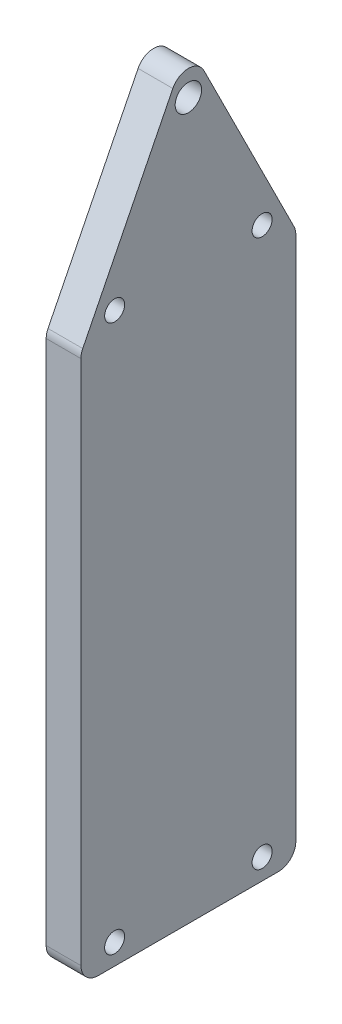
ISO-10303-21;
HEADER;
FILE_DESCRIPTION(('STEP AP214'),'2;1');
FILE_NAME('part.step','',(''),(''),'','','');
FILE_SCHEMA(('AUTOMOTIVE_DESIGN { 1 0 10303 214 1 1 1 1 }'));
ENDSEC;
DATA;
#1=APPLICATION_CONTEXT('core data for automotive mechanical design processes');
#2=APPLICATION_PROTOCOL_DEFINITION('international standard','automotive_design',2000,#1);
#3=PRODUCT_CONTEXT('',#1,'mechanical');
#4=PRODUCT('Part','Part','',(#3));
#5=PRODUCT_RELATED_PRODUCT_CATEGORY('part','',(#4));
#6=PRODUCT_DEFINITION_FORMATION('','',#4);
#7=PRODUCT_DEFINITION_CONTEXT('part definition',#1,'design');
#8=PRODUCT_DEFINITION('design','',#6,#7);
#9=PRODUCT_DEFINITION_SHAPE('','',#8);
#10=(LENGTH_UNIT() NAMED_UNIT(*) SI_UNIT(.MILLI.,.METRE.));
#11=(NAMED_UNIT(*) PLANE_ANGLE_UNIT() SI_UNIT($,.RADIAN.));
#12=(NAMED_UNIT(*) SI_UNIT($,.STERADIAN.) SOLID_ANGLE_UNIT());
#13=UNCERTAINTY_MEASURE_WITH_UNIT(LENGTH_MEASURE(1.E-05),#10,'distance_accuracy_value','');
#14=(GEOMETRIC_REPRESENTATION_CONTEXT(3) GLOBAL_UNCERTAINTY_ASSIGNED_CONTEXT((#13)) GLOBAL_UNIT_ASSIGNED_CONTEXT((#10,
#11,#12)) REPRESENTATION_CONTEXT('',''));
#15=CARTESIAN_POINT('',(0.,0.,0.));
#16=DIRECTION('',(0.,0.,1.));
#17=DIRECTION('',(1.,0.,0.));
#18=AXIS2_PLACEMENT_3D('',#15,#16,#17);
#19=CARTESIAN_POINT('',(6.35,0.,19.6394094971371));
#20=DIRECTION('',(0.,0.,-1.));
#21=DIRECTION('',(0.,1.,0.));
#22=AXIS2_PLACEMENT_3D('',#19,#20,#21);
#23=PLANE('',#22);
#24=DIRECTION('',(0.,-1.,0.));
#25=VECTOR('',#24,1.);
#26=CARTESIAN_POINT('',(0.,0.,19.6394094971371));
#27=LINE('',#26,#25);
#28=CARTESIAN_POINT('',(0.,-4.55951582856184,19.6394094971371));
#29=VERTEX_POINT('',#28);
#30=CARTESIAN_POINT('',(0.,-100.635,19.6394094971371));
#31=VERTEX_POINT('',#30);
#32=EDGE_CURVE('E140',#29,#31,#27,.T.);
#33=ORIENTED_EDGE('',*,*,#32,.T.);
#34=DIRECTION('',(-1.,0.,0.));
#35=VECTOR('',#34,1.);
#36=CARTESIAN_POINT('',(6.35,-100.635,19.6394094971371));
#37=LINE('',#36,#35);
#38=CARTESIAN_POINT('',(6.35,-100.635,19.6394094971371));
#39=VERTEX_POINT('',#38);
#40=EDGE_CURVE('E117',#31,#39,#37,.F.);
#41=ORIENTED_EDGE('',*,*,#40,.T.);
#42=DIRECTION('',(0.,-1.,0.));
#43=VECTOR('',#42,1.);
#44=CARTESIAN_POINT('',(6.35,0.,19.6394094971371));
#45=LINE('',#44,#43);
#46=CARTESIAN_POINT('',(6.35,-4.55951582856184,19.6394094971371));
#47=VERTEX_POINT('',#46);
#48=EDGE_CURVE('E282',#47,#39,#45,.T.);
#49=ORIENTED_EDGE('',*,*,#48,.F.);
#50=DIRECTION('',(-1.,0.,0.));
#51=VECTOR('',#50,1.);
#52=CARTESIAN_POINT('',(0.,-4.55951582856184,19.6394094971371));
#53=LINE('',#52,#51);
#54=EDGE_CURVE('E122',#47,#29,#53,.T.);
#55=ORIENTED_EDGE('',*,*,#54,.T.);
#56=EDGE_LOOP('',(#33,#41,#49,#55));
#57=FACE_BOUND('',#56,.T.);
#58=ADVANCED_FACE('F34',(#57),#23,.F.);
#59=CARTESIAN_POINT('',(6.35,-103.81,0.));
#60=DIRECTION('',(0.,1.,0.));
#61=DIRECTION('',(0.,0.,1.));
#62=AXIS2_PLACEMENT_3D('',#59,#60,#61);
#63=PLANE('',#62);
#64=DIRECTION('',(0.,0.,-1.));
#65=VECTOR('',#64,1.);
#66=CARTESIAN_POINT('',(6.35,-103.81,0.));
#67=LINE('',#66,#65);
#68=CARTESIAN_POINT('',(6.35,-103.81,16.4644094971371));
#69=VERTEX_POINT('',#68);
#70=CARTESIAN_POINT('',(6.35,-103.81,-16.4644094971371));
#71=VERTEX_POINT('',#70);
#72=EDGE_CURVE('E132',#69,#71,#67,.T.);
#73=ORIENTED_EDGE('',*,*,#72,.F.);
#74=DIRECTION('',(-1.,0.,0.));
#75=VECTOR('',#74,1.);
#76=CARTESIAN_POINT('',(6.35,-103.81,16.4644094971371));
#77=LINE('',#76,#75);
#78=CARTESIAN_POINT('',(0.,-103.81,16.4644094971371));
#79=VERTEX_POINT('',#78);
#80=EDGE_CURVE('E116',#69,#79,#77,.T.);
#81=ORIENTED_EDGE('',*,*,#80,.T.);
#82=DIRECTION('',(0.,0.,-1.));
#83=VECTOR('',#82,1.);
#84=CARTESIAN_POINT('',(0.,-103.81,0.));
#85=LINE('',#84,#83);
#86=CARTESIAN_POINT('',(0.,-103.81,-16.4644094971371));
#87=VERTEX_POINT('',#86);
#88=EDGE_CURVE('E129',#79,#87,#85,.T.);
#89=ORIENTED_EDGE('',*,*,#88,.T.);
#90=DIRECTION('',(-1.,0.,0.));
#91=VECTOR('',#90,1.);
#92=CARTESIAN_POINT('',(6.35,-103.81,-16.4644094971371));
#93=LINE('',#92,#91);
#94=EDGE_CURVE('E134',#87,#71,#93,.F.);
#95=ORIENTED_EDGE('',*,*,#94,.T.);
#96=EDGE_LOOP('',(#73,#81,#89,#95));
#97=FACE_BOUND('',#96,.T.);
#98=ADVANCED_FACE('F128',(#97),#63,.F.);
#99=CARTESIAN_POINT('',(6.35,0.,-19.6394094971371));
#100=DIRECTION('',(0.,0.,-1.));
#101=DIRECTION('',(0.,1.,0.));
#102=AXIS2_PLACEMENT_3D('',#99,#100,#101);
#103=PLANE('',#102);
#104=DIRECTION('',(0.,-1.,0.));
#105=VECTOR('',#104,1.);
#106=CARTESIAN_POINT('',(6.35,0.,-19.6394094971371));
#107=LINE('',#106,#105);
#108=CARTESIAN_POINT('',(6.35,-4.55951582856183,-19.6394094971371));
#109=VERTEX_POINT('',#108);
#110=CARTESIAN_POINT('',(6.35,-100.635,-19.6394094971371));
#111=VERTEX_POINT('',#110);
#112=EDGE_CURVE('E213',#109,#111,#107,.T.);
#113=ORIENTED_EDGE('',*,*,#112,.T.);
#114=DIRECTION('',(-1.,0.,0.));
#115=VECTOR('',#114,1.);
#116=CARTESIAN_POINT('',(0.,-100.635,-19.6394094971371));
#117=LINE('',#116,#115);
#118=CARTESIAN_POINT('',(0.,-100.635,-19.6394094971371));
#119=VERTEX_POINT('',#118);
#120=EDGE_CURVE('E185',#111,#119,#117,.T.);
#121=ORIENTED_EDGE('',*,*,#120,.T.);
#122=DIRECTION('',(0.,-1.,0.));
#123=VECTOR('',#122,1.);
#124=CARTESIAN_POINT('',(0.,0.,-19.6394094971371));
#125=LINE('',#124,#123);
#126=CARTESIAN_POINT('',(0.,-4.55951582856183,-19.6394094971371));
#127=VERTEX_POINT('',#126);
#128=EDGE_CURVE('E139',#127,#119,#125,.T.);
#129=ORIENTED_EDGE('',*,*,#128,.F.);
#130=DIRECTION('',(-1.,0.,0.));
#131=VECTOR('',#130,1.);
#132=CARTESIAN_POINT('',(6.35,-4.55951582856183,-19.6394094971371));
#133=LINE('',#132,#131);
#134=EDGE_CURVE('E183',#127,#109,#133,.F.);
#135=ORIENTED_EDGE('',*,*,#134,.T.);
#136=EDGE_LOOP('',(#113,#121,#129,#135));
#137=FACE_BOUND('',#136,.T.);
#138=ADVANCED_FACE('F248',(#137),#103,.T.);
#139=CARTESIAN_POINT('',(6.35,7.09376379885484,-14.1875275977097));
#140=DIRECTION('',(0.,0.447213595499958,-0.894427190999916));
#141=DIRECTION('',(0.,0.894427190999916,0.447213595499958));
#142=AXIS2_PLACEMENT_3D('',#139,#140,#141);
#143=PLANE('',#142);
#144=DIRECTION('',(0.,-0.894427190999916,-0.447213595499958));
#145=VECTOR('',#144,1.);
#146=CARTESIAN_POINT('',(0.,7.09376379885484,-14.1875275977097));
#147=LINE('',#146,#145);
#148=CARTESIAN_POINT('',(0.,29.7892063314247,-2.83980633142473));
#149=VERTEX_POINT('',#148);
#150=CARTESIAN_POINT('',(0.,-3.13961266284947,-19.3042158285618));
#151=VERTEX_POINT('',#150);
#152=EDGE_CURVE('E142',#149,#151,#147,.T.);
#153=ORIENTED_EDGE('',*,*,#152,.F.);
#154=DIRECTION('',(-1.,0.,0.));
#155=VECTOR('',#154,1.);
#156=CARTESIAN_POINT('',(6.35,29.7892063314247,-2.83980633142473));
#157=LINE('',#156,#155);
#158=CARTESIAN_POINT('',(6.35,29.7892063314247,-2.83980633142473));
#159=VERTEX_POINT('',#158);
#160=EDGE_CURVE('E11',#149,#159,#157,.F.);
#161=ORIENTED_EDGE('',*,*,#160,.T.);
#162=DIRECTION('',(0.,-0.894427190999916,-0.447213595499958));
#163=VECTOR('',#162,1.);
#164=CARTESIAN_POINT('',(6.35,7.09376379885484,-14.1875275977097));
#165=LINE('',#164,#163);
#166=CARTESIAN_POINT('',(6.35,-3.13961266284947,-19.3042158285618));
#167=VERTEX_POINT('',#166);
#168=EDGE_CURVE('E198',#159,#167,#165,.T.);
#169=ORIENTED_EDGE('',*,*,#168,.T.);
#170=DIRECTION('',(-1.,0.,0.));
#171=VECTOR('',#170,1.);
#172=CARTESIAN_POINT('',(6.35,-3.13961266284947,-19.3042158285618));
#173=LINE('',#172,#171);
#174=EDGE_CURVE('E42',#167,#151,#173,.T.);
#175=ORIENTED_EDGE('',*,*,#174,.T.);
#176=EDGE_LOOP('',(#153,#161,#169,#175));
#177=FACE_BOUND('',#176,.T.);
#178=ADVANCED_FACE('F196',(#177),#143,.T.);
#179=CARTESIAN_POINT('',(6.35,26.9494,0.));
#180=DIRECTION('',(-1.,0.,0.));
#181=DIRECTION('',(0.,0.,1.));
#182=AXIS2_PLACEMENT_3D('',#179,#180,#181);
#183=CYLINDRICAL_SURFACE('',#182,2.413);
#184=CARTESIAN_POINT('',(6.35,26.9494,0.));
#185=DIRECTION('',(1.,0.,0.));
#186=DIRECTION('',(0.,0.,-1.));
#187=AXIS2_PLACEMENT_3D('',#184,#185,#186);
#188=CIRCLE('',#187,2.413);
#189=CARTESIAN_POINT('',(6.35,26.9494,-2.413));
#190=VERTEX_POINT('',#189);
#191=EDGE_CURVE('E211',#190,#190,#188,.T.);
#192=ORIENTED_EDGE('',*,*,#191,.T.);
#193=EDGE_LOOP('',(#192));
#194=FACE_BOUND('',#193,.T.);
#195=CARTESIAN_POINT('',(0.,26.9494,0.));
#196=DIRECTION('',(1.,0.,0.));
#197=DIRECTION('',(0.,0.,-1.));
#198=AXIS2_PLACEMENT_3D('',#195,#196,#197);
#199=CIRCLE('',#198,2.413);
#200=CARTESIAN_POINT('',(0.,26.9494,-2.413));
#201=VERTEX_POINT('',#200);
#202=EDGE_CURVE('E156',#201,#201,#199,.T.);
#203=ORIENTED_EDGE('',*,*,#202,.F.);
#204=EDGE_LOOP('',(#203));
#205=FACE_BOUND('',#204,.T.);
#206=ADVANCED_FACE('F255',(#194,#205),#183,.F.);
#207=CARTESIAN_POINT('',(6.35,0.,-13.4747));
#208=DIRECTION('',(-1.,0.,0.));
#209=DIRECTION('',(0.,0.,1.));
#210=AXIS2_PLACEMENT_3D('',#207,#208,#209);
#211=CYLINDRICAL_SURFACE('',#210,1.8288);
#212=CARTESIAN_POINT('',(6.35,0.,-13.4747));
#213=DIRECTION('',(1.,0.,0.));
#214=DIRECTION('',(0.,0.,-1.));
#215=AXIS2_PLACEMENT_3D('',#212,#213,#214);
#216=CIRCLE('',#215,1.8288);
#217=CARTESIAN_POINT('',(6.35,0.,-15.3035));
#218=VERTEX_POINT('',#217);
#219=EDGE_CURVE('E208',#218,#218,#216,.T.);
#220=ORIENTED_EDGE('',*,*,#219,.T.);
#221=EDGE_LOOP('',(#220));
#222=FACE_BOUND('',#221,.T.);
#223=CARTESIAN_POINT('',(0.,0.,-13.4747));
#224=DIRECTION('',(1.,0.,0.));
#225=DIRECTION('',(0.,0.,-1.));
#226=AXIS2_PLACEMENT_3D('',#223,#224,#225);
#227=CIRCLE('',#226,1.8288);
#228=CARTESIAN_POINT('',(0.,0.,-15.3035));
#229=VERTEX_POINT('',#228);
#230=EDGE_CURVE('E153',#229,#229,#227,.T.);
#231=ORIENTED_EDGE('',*,*,#230,.F.);
#232=EDGE_LOOP('',(#231));
#233=FACE_BOUND('',#232,.T.);
#234=ADVANCED_FACE('F239',(#222,#233),#211,.F.);
#235=CARTESIAN_POINT('',(6.35,7.09376379885484,14.1875275977097));
#236=DIRECTION('',(0.,0.447213595499958,0.894427190999916));
#237=DIRECTION('',(0.,-0.894427190999916,0.447213595499958));
#238=AXIS2_PLACEMENT_3D('',#235,#236,#237);
#239=PLANE('',#238);
#240=DIRECTION('',(0.,0.894427190999916,-0.447213595499958));
#241=VECTOR('',#240,1.);
#242=CARTESIAN_POINT('',(6.35,7.09376379885484,14.1875275977097));
#243=LINE('',#242,#241);
#244=CARTESIAN_POINT('',(6.35,-3.13961266284947,19.3042158285618));
#245=VERTEX_POINT('',#244);
#246=CARTESIAN_POINT('',(6.35,29.7892063314247,2.83980633142473));
#247=VERTEX_POINT('',#246);
#248=EDGE_CURVE('E206',#245,#247,#243,.T.);
#249=ORIENTED_EDGE('',*,*,#248,.T.);
#250=DIRECTION('',(-1.,0.,0.));
#251=VECTOR('',#250,1.);
#252=CARTESIAN_POINT('',(6.35,29.7892063314247,2.83980633142473));
#253=LINE('',#252,#251);
#254=CARTESIAN_POINT('',(0.,29.7892063314247,2.83980633142473));
#255=VERTEX_POINT('',#254);
#256=EDGE_CURVE('E189',#247,#255,#253,.T.);
#257=ORIENTED_EDGE('',*,*,#256,.T.);
#258=DIRECTION('',(0.,0.894427190999916,-0.447213595499958));
#259=VECTOR('',#258,1.);
#260=CARTESIAN_POINT('',(0.,7.09376379885484,14.1875275977097));
#261=LINE('',#260,#259);
#262=CARTESIAN_POINT('',(0.,-3.13961266284947,19.3042158285618));
#263=VERTEX_POINT('',#262);
#264=EDGE_CURVE('E150',#263,#255,#261,.T.);
#265=ORIENTED_EDGE('',*,*,#264,.F.);
#266=DIRECTION('',(-1.,0.,0.));
#267=VECTOR('',#266,1.);
#268=CARTESIAN_POINT('',(6.35,-3.13961266284947,19.3042158285618));
#269=LINE('',#268,#267);
#270=EDGE_CURVE('E56',#263,#245,#269,.F.);
#271=ORIENTED_EDGE('',*,*,#270,.T.);
#272=EDGE_LOOP('',(#249,#257,#265,#271));
#273=FACE_BOUND('',#272,.T.);
#274=ADVANCED_FACE('F205',(#273),#239,.T.);
#275=CARTESIAN_POINT('',(6.35,-100.,13.4747));
#276=DIRECTION('',(-1.,0.,0.));
#277=DIRECTION('',(0.,0.,1.));
#278=AXIS2_PLACEMENT_3D('',#275,#276,#277);
#279=CYLINDRICAL_SURFACE('',#278,1.8288);
#280=CARTESIAN_POINT('',(6.35,-100.,13.4747));
#281=DIRECTION('',(1.,0.,0.));
#282=DIRECTION('',(0.,0.,-1.));
#283=AXIS2_PLACEMENT_3D('',#280,#281,#282);
#284=CIRCLE('',#283,1.8288);
#285=CARTESIAN_POINT('',(6.35,-100.,11.6459));
#286=VERTEX_POINT('',#285);
#287=EDGE_CURVE('E278',#286,#286,#284,.T.);
#288=ORIENTED_EDGE('',*,*,#287,.T.);
#289=EDGE_LOOP('',(#288));
#290=FACE_BOUND('',#289,.T.);
#291=CARTESIAN_POINT('',(0.,-100.,13.4747));
#292=DIRECTION('',(1.,0.,0.));
#293=DIRECTION('',(0.,0.,-1.));
#294=AXIS2_PLACEMENT_3D('',#291,#292,#293);
#295=CIRCLE('',#294,1.8288);
#296=CARTESIAN_POINT('',(0.,-100.,11.6459));
#297=VERTEX_POINT('',#296);
#298=EDGE_CURVE('E144',#297,#297,#295,.T.);
#299=ORIENTED_EDGE('',*,*,#298,.F.);
#300=EDGE_LOOP('',(#299));
#301=FACE_BOUND('',#300,.T.);
#302=ADVANCED_FACE('F227',(#290,#301),#279,.F.);
#303=CARTESIAN_POINT('',(6.35,-100.,-13.4747));
#304=DIRECTION('',(-1.,0.,0.));
#305=DIRECTION('',(0.,0.,1.));
#306=AXIS2_PLACEMENT_3D('',#303,#304,#305);
#307=CYLINDRICAL_SURFACE('',#306,1.8288);
#308=CARTESIAN_POINT('',(6.35,-100.,-13.4747));
#309=DIRECTION('',(1.,0.,0.));
#310=DIRECTION('',(0.,0.,-1.));
#311=AXIS2_PLACEMENT_3D('',#308,#309,#310);
#312=CIRCLE('',#311,1.8288);
#313=CARTESIAN_POINT('',(6.35,-100.,-15.3035));
#314=VERTEX_POINT('',#313);
#315=EDGE_CURVE('E162',#314,#314,#312,.T.);
#316=ORIENTED_EDGE('',*,*,#315,.T.);
#317=EDGE_LOOP('',(#316));
#318=FACE_BOUND('',#317,.T.);
#319=CARTESIAN_POINT('',(0.,-100.,-13.4747));
#320=DIRECTION('',(1.,0.,0.));
#321=DIRECTION('',(0.,0.,-1.));
#322=AXIS2_PLACEMENT_3D('',#319,#320,#321);
#323=CIRCLE('',#322,1.8288);
#324=CARTESIAN_POINT('',(0.,-100.,-15.3035));
#325=VERTEX_POINT('',#324);
#326=EDGE_CURVE('E221',#325,#325,#323,.T.);
#327=ORIENTED_EDGE('',*,*,#326,.F.);
#328=EDGE_LOOP('',(#327));
#329=FACE_BOUND('',#328,.T.);
#330=ADVANCED_FACE('F229',(#318,#329),#307,.F.);
#331=CARTESIAN_POINT('',(6.35,0.,13.4747));
#332=DIRECTION('',(-1.,0.,0.));
#333=DIRECTION('',(0.,0.,1.));
#334=AXIS2_PLACEMENT_3D('',#331,#332,#333);
#335=CYLINDRICAL_SURFACE('',#334,1.8288);
#336=CARTESIAN_POINT('',(6.35,0.,13.4747));
#337=DIRECTION('',(1.,0.,0.));
#338=DIRECTION('',(0.,0.,-1.));
#339=AXIS2_PLACEMENT_3D('',#336,#337,#338);
#340=CIRCLE('',#339,1.8288);
#341=CARTESIAN_POINT('',(6.35,0.,11.6459));
#342=VERTEX_POINT('',#341);
#343=EDGE_CURVE('E163',#342,#342,#340,.T.);
#344=ORIENTED_EDGE('',*,*,#343,.T.);
#345=EDGE_LOOP('',(#344));
#346=FACE_BOUND('',#345,.T.);
#347=CARTESIAN_POINT('',(0.,0.,13.4747));
#348=DIRECTION('',(1.,0.,0.));
#349=DIRECTION('',(0.,0.,-1.));
#350=AXIS2_PLACEMENT_3D('',#347,#348,#349);
#351=CIRCLE('',#350,1.8288);
#352=CARTESIAN_POINT('',(0.,0.,11.6459));
#353=VERTEX_POINT('',#352);
#354=EDGE_CURVE('E159',#353,#353,#351,.T.);
#355=ORIENTED_EDGE('',*,*,#354,.F.);
#356=EDGE_LOOP('',(#355));
#357=FACE_BOUND('',#356,.T.);
#358=ADVANCED_FACE('F236',(#346,#357),#335,.F.);
#359=CARTESIAN_POINT('',(6.35,0.,0.));
#360=DIRECTION('',(1.,0.,0.));
#361=DIRECTION('',(0.,0.,-1.));
#362=AXIS2_PLACEMENT_3D('',#359,#360,#361);
#363=PLANE('',#362);
#364=ORIENTED_EDGE('',*,*,#315,.F.);
#365=EDGE_LOOP('',(#364));
#366=FACE_BOUND('',#365,.T.);
#367=ORIENTED_EDGE('',*,*,#287,.F.);
#368=EDGE_LOOP('',(#367));
#369=FACE_BOUND('',#368,.T.);
#370=ORIENTED_EDGE('',*,*,#48,.T.);
#371=CARTESIAN_POINT('',(6.35,-100.635,16.4644094971371));
#372=DIRECTION('',(1.,0.,0.));
#373=DIRECTION('',(0.,0.,-1.));
#374=AXIS2_PLACEMENT_3D('',#371,#372,#373);
#375=CIRCLE('',#374,3.175);
#376=EDGE_CURVE('E181',#39,#69,#375,.T.);
#377=ORIENTED_EDGE('',*,*,#376,.T.);
#378=ORIENTED_EDGE('',*,*,#72,.T.);
#379=CARTESIAN_POINT('',(6.35,-100.635,-16.4644094971371));
#380=DIRECTION('',(1.,0.,0.));
#381=DIRECTION('',(0.,0.,-1.));
#382=AXIS2_PLACEMENT_3D('',#379,#380,#381);
#383=CIRCLE('',#382,3.175);
#384=EDGE_CURVE('E179',#71,#111,#383,.T.);
#385=ORIENTED_EDGE('',*,*,#384,.T.);
#386=ORIENTED_EDGE('',*,*,#112,.F.);
#387=CARTESIAN_POINT('',(6.35,-4.55951582856183,-16.4644094971371));
#388=DIRECTION('',(1.,0.,0.));
#389=DIRECTION('',(0.,0.,-1.));
#390=AXIS2_PLACEMENT_3D('',#387,#388,#389);
#391=CIRCLE('',#390,3.175);
#392=EDGE_CURVE('E174',#109,#167,#391,.T.);
#393=ORIENTED_EDGE('',*,*,#392,.T.);
#394=ORIENTED_EDGE('',*,*,#168,.F.);
#395=CARTESIAN_POINT('',(6.35,28.3693031657124,0.));
#396=DIRECTION('',(1.,0.,0.));
#397=DIRECTION('',(0.,0.,-1.));
#398=AXIS2_PLACEMENT_3D('',#395,#396,#397);
#399=CIRCLE('',#398,3.175);
#400=EDGE_CURVE('E49',#159,#247,#399,.T.);
#401=ORIENTED_EDGE('',*,*,#400,.T.);
#402=ORIENTED_EDGE('',*,*,#248,.F.);
#403=CARTESIAN_POINT('',(6.35,-4.55951582856184,16.4644094971371));
#404=DIRECTION('',(1.,0.,0.));
#405=DIRECTION('',(0.,0.,-1.));
#406=AXIS2_PLACEMENT_3D('',#403,#404,#405);
#407=CIRCLE('',#406,3.175);
#408=EDGE_CURVE('E176',#245,#47,#407,.T.);
#409=ORIENTED_EDGE('',*,*,#408,.T.);
#410=EDGE_LOOP('',(#370,#377,#378,#385,#386,#393,#394,#401,#402,#409));
#411=FACE_BOUND('',#410,.T.);
#412=ORIENTED_EDGE('',*,*,#219,.F.);
#413=EDGE_LOOP('',(#412));
#414=FACE_BOUND('',#413,.T.);
#415=ORIENTED_EDGE('',*,*,#191,.F.);
#416=EDGE_LOOP('',(#415));
#417=FACE_BOUND('',#416,.T.);
#418=ORIENTED_EDGE('',*,*,#343,.F.);
#419=EDGE_LOOP('',(#418));
#420=FACE_BOUND('',#419,.T.);
#421=ADVANCED_FACE('F265',(#366,#369,#411,#414,#417,#420),#363,.T.);
#422=CARTESIAN_POINT('',(0.,0.,0.));
#423=DIRECTION('',(1.,0.,0.));
#424=DIRECTION('',(0.,0.,-1.));
#425=AXIS2_PLACEMENT_3D('',#422,#423,#424);
#426=PLANE('',#425);
#427=ORIENTED_EDGE('',*,*,#326,.T.);
#428=EDGE_LOOP('',(#427));
#429=FACE_BOUND('',#428,.T.);
#430=ORIENTED_EDGE('',*,*,#298,.T.);
#431=EDGE_LOOP('',(#430));
#432=FACE_BOUND('',#431,.T.);
#433=ORIENTED_EDGE('',*,*,#88,.F.);
#434=CARTESIAN_POINT('',(0.,-100.635,16.4644094971371));
#435=DIRECTION('',(1.,0.,0.));
#436=DIRECTION('',(0.,0.,-1.));
#437=AXIS2_PLACEMENT_3D('',#434,#435,#436);
#438=CIRCLE('',#437,3.175);
#439=EDGE_CURVE('E112',#79,#31,#438,.F.);
#440=ORIENTED_EDGE('',*,*,#439,.T.);
#441=ORIENTED_EDGE('',*,*,#32,.F.);
#442=CARTESIAN_POINT('',(0.,-4.55951582856184,16.4644094971371));
#443=DIRECTION('',(1.,0.,0.));
#444=DIRECTION('',(0.,0.,-1.));
#445=AXIS2_PLACEMENT_3D('',#442,#443,#444);
#446=CIRCLE('',#445,3.175);
#447=EDGE_CURVE('E166',#29,#263,#446,.F.);
#448=ORIENTED_EDGE('',*,*,#447,.T.);
#449=ORIENTED_EDGE('',*,*,#264,.T.);
#450=CARTESIAN_POINT('',(0.,28.3693031657124,0.));
#451=DIRECTION('',(1.,0.,0.));
#452=DIRECTION('',(0.,0.,-1.));
#453=AXIS2_PLACEMENT_3D('',#450,#451,#452);
#454=CIRCLE('',#453,3.175);
#455=EDGE_CURVE('E168',#255,#149,#454,.F.);
#456=ORIENTED_EDGE('',*,*,#455,.T.);
#457=ORIENTED_EDGE('',*,*,#152,.T.);
#458=CARTESIAN_POINT('',(0.,-4.55951582856183,-16.4644094971371));
#459=DIRECTION('',(1.,0.,0.));
#460=DIRECTION('',(0.,0.,-1.));
#461=AXIS2_PLACEMENT_3D('',#458,#459,#460);
#462=CIRCLE('',#461,3.175);
#463=EDGE_CURVE('E133',#151,#127,#462,.F.);
#464=ORIENTED_EDGE('',*,*,#463,.T.);
#465=ORIENTED_EDGE('',*,*,#128,.T.);
#466=CARTESIAN_POINT('',(0.,-100.635,-16.4644094971371));
#467=DIRECTION('',(1.,0.,0.));
#468=DIRECTION('',(0.,0.,-1.));
#469=AXIS2_PLACEMENT_3D('',#466,#467,#468);
#470=CIRCLE('',#469,3.175);
#471=EDGE_CURVE('E123',#119,#87,#470,.F.);
#472=ORIENTED_EDGE('',*,*,#471,.T.);
#473=EDGE_LOOP('',(#433,#440,#441,#448,#449,#456,#457,#464,#465,#472));
#474=FACE_BOUND('',#473,.T.);
#475=ORIENTED_EDGE('',*,*,#230,.T.);
#476=EDGE_LOOP('',(#475));
#477=FACE_BOUND('',#476,.T.);
#478=ORIENTED_EDGE('',*,*,#202,.T.);
#479=EDGE_LOOP('',(#478));
#480=FACE_BOUND('',#479,.T.);
#481=ORIENTED_EDGE('',*,*,#354,.T.);
#482=EDGE_LOOP('',(#481));
#483=FACE_BOUND('',#482,.T.);
#484=ADVANCED_FACE('F136',(#429,#432,#474,#477,#480,#483),#426,.F.);
#485=CARTESIAN_POINT('',(6.35,-100.635,16.4644094971371));
#486=DIRECTION('',(-1.,0.,0.));
#487=DIRECTION('',(0.,0.,1.));
#488=AXIS2_PLACEMENT_3D('',#485,#486,#487);
#489=CYLINDRICAL_SURFACE('',#488,3.175);
#490=ORIENTED_EDGE('',*,*,#376,.F.);
#491=ORIENTED_EDGE('',*,*,#40,.F.);
#492=ORIENTED_EDGE('',*,*,#439,.F.);
#493=ORIENTED_EDGE('',*,*,#80,.F.);
#494=EDGE_LOOP('',(#490,#491,#492,#493));
#495=FACE_BOUND('',#494,.T.);
#496=ADVANCED_FACE('F115',(#495),#489,.T.);
#497=CARTESIAN_POINT('',(6.35,-100.635,-16.4644094971371));
#498=DIRECTION('',(1.,0.,0.));
#499=DIRECTION('',(0.,0.,-1.));
#500=AXIS2_PLACEMENT_3D('',#497,#498,#499);
#501=CYLINDRICAL_SURFACE('',#500,3.175);
#502=ORIENTED_EDGE('',*,*,#384,.F.);
#503=ORIENTED_EDGE('',*,*,#94,.F.);
#504=ORIENTED_EDGE('',*,*,#471,.F.);
#505=ORIENTED_EDGE('',*,*,#120,.F.);
#506=EDGE_LOOP('',(#502,#503,#504,#505));
#507=FACE_BOUND('',#506,.T.);
#508=ADVANCED_FACE('F307',(#507),#501,.T.);
#509=CARTESIAN_POINT('',(6.35,28.3693031657124,0.));
#510=DIRECTION('',(-1.,0.,0.));
#511=DIRECTION('',(0.,0.,1.));
#512=AXIS2_PLACEMENT_3D('',#509,#510,#511);
#513=CYLINDRICAL_SURFACE('',#512,3.175);
#514=ORIENTED_EDGE('',*,*,#400,.F.);
#515=ORIENTED_EDGE('',*,*,#160,.F.);
#516=ORIENTED_EDGE('',*,*,#455,.F.);
#517=ORIENTED_EDGE('',*,*,#256,.F.);
#518=EDGE_LOOP('',(#514,#515,#516,#517));
#519=FACE_BOUND('',#518,.T.);
#520=ADVANCED_FACE('F204',(#519),#513,.T.);
#521=CARTESIAN_POINT('',(6.35,-4.55951582856184,16.4644094971371));
#522=DIRECTION('',(1.,0.,0.));
#523=DIRECTION('',(0.,0.,-1.));
#524=AXIS2_PLACEMENT_3D('',#521,#522,#523);
#525=CYLINDRICAL_SURFACE('',#524,3.175);
#526=ORIENTED_EDGE('',*,*,#408,.F.);
#527=ORIENTED_EDGE('',*,*,#270,.F.);
#528=ORIENTED_EDGE('',*,*,#447,.F.);
#529=ORIENTED_EDGE('',*,*,#54,.F.);
#530=EDGE_LOOP('',(#526,#527,#528,#529));
#531=FACE_BOUND('',#530,.T.);
#532=ADVANCED_FACE('F314',(#531),#525,.T.);
#533=CARTESIAN_POINT('',(6.35,-4.55951582856183,-16.4644094971371));
#534=DIRECTION('',(-1.,0.,0.));
#535=DIRECTION('',(0.,0.,1.));
#536=AXIS2_PLACEMENT_3D('',#533,#534,#535);
#537=CYLINDRICAL_SURFACE('',#536,3.175);
#538=ORIENTED_EDGE('',*,*,#392,.F.);
#539=ORIENTED_EDGE('',*,*,#134,.F.);
#540=ORIENTED_EDGE('',*,*,#463,.F.);
#541=ORIENTED_EDGE('',*,*,#174,.F.);
#542=EDGE_LOOP('',(#538,#539,#540,#541));
#543=FACE_BOUND('',#542,.T.);
#544=ADVANCED_FACE('F36',(#543),#537,.T.);
#545=CLOSED_SHELL('',(#58,#98,#138,#178,#206,#234,#274,#302,#330,#358,#421,#484,#496,#508,#520,
#532,#544));
#546=MANIFOLD_SOLID_BREP('B2',#545);
#547=ADVANCED_BREP_SHAPE_REPRESENTATION('',(#18,#546),#14);
#548=SHAPE_DEFINITION_REPRESENTATION(#9,#547);
ENDSEC;
END-ISO-10303-21;
